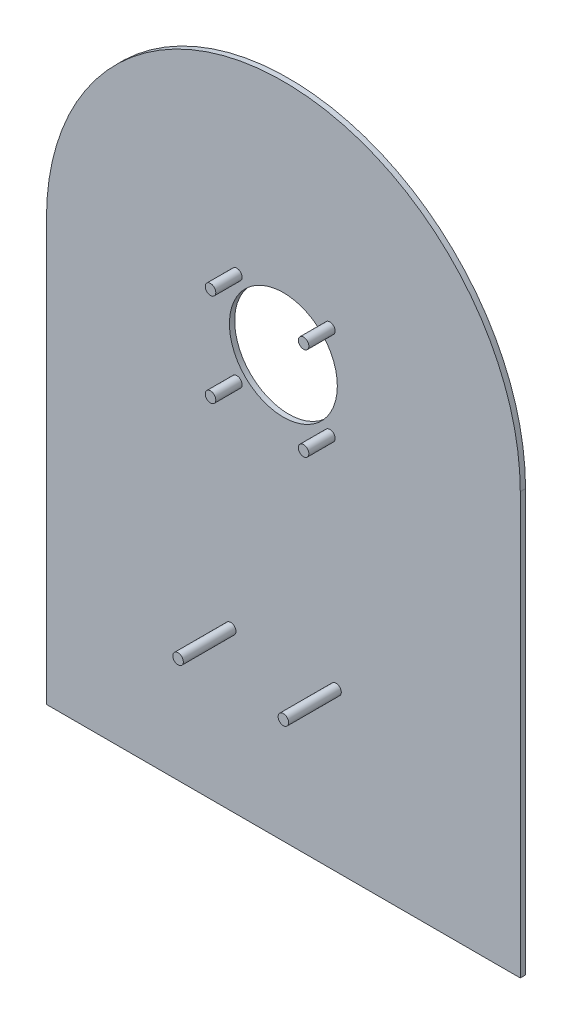
ISO-10303-21;
HEADER;
FILE_DESCRIPTION(('STEP AP214'),'2;1');
FILE_NAME('part.step','',(''),(''),'','','');
FILE_SCHEMA(('AUTOMOTIVE_DESIGN { 1 0 10303 214 1 1 1 1 }'));
ENDSEC;
DATA;
#1=APPLICATION_CONTEXT('core data for automotive mechanical design processes');
#2=APPLICATION_PROTOCOL_DEFINITION('international standard','automotive_design',2000,#1);
#3=PRODUCT_CONTEXT('',#1,'mechanical');
#4=PRODUCT('Part','Part','',(#3));
#5=PRODUCT_RELATED_PRODUCT_CATEGORY('part','',(#4));
#6=PRODUCT_DEFINITION_FORMATION('','',#4);
#7=PRODUCT_DEFINITION_CONTEXT('part definition',#1,'design');
#8=PRODUCT_DEFINITION('design','',#6,#7);
#9=PRODUCT_DEFINITION_SHAPE('','',#8);
#10=(LENGTH_UNIT() NAMED_UNIT(*) SI_UNIT(.MILLI.,.METRE.));
#11=(NAMED_UNIT(*) PLANE_ANGLE_UNIT() SI_UNIT($,.RADIAN.));
#12=(NAMED_UNIT(*) SI_UNIT($,.STERADIAN.) SOLID_ANGLE_UNIT());
#13=UNCERTAINTY_MEASURE_WITH_UNIT(LENGTH_MEASURE(1.E-05),#10,'distance_accuracy_value','');
#14=(GEOMETRIC_REPRESENTATION_CONTEXT(3) GLOBAL_UNCERTAINTY_ASSIGNED_CONTEXT((#13)) GLOBAL_UNIT_ASSIGNED_CONTEXT((#10,
#11,#12)) REPRESENTATION_CONTEXT('',''));
#15=CARTESIAN_POINT('',(0.,0.,0.));
#16=DIRECTION('',(0.,0.,1.));
#17=DIRECTION('',(1.,0.,0.));
#18=AXIS2_PLACEMENT_3D('',#15,#16,#17);
#19=CARTESIAN_POINT('',(0.,0.,2.));
#20=DIRECTION('',(0.,0.,1.));
#21=DIRECTION('',(1.,0.,0.));
#22=AXIS2_PLACEMENT_3D('',#19,#20,#21);
#23=PLANE('',#22);
#24=CARTESIAN_POINT('',(-20.,-100.,2.));
#25=DIRECTION('',(0.,0.,1.));
#26=DIRECTION('',(1.,0.,0.));
#27=AXIS2_PLACEMENT_3D('',#24,#25,#26);
#28=CIRCLE('',#27,2.);
#29=CARTESIAN_POINT('',(-18.,-100.,2.));
#30=VERTEX_POINT('',#29);
#31=EDGE_CURVE('E142',#30,#30,#28,.T.);
#32=ORIENTED_EDGE('',*,*,#31,.F.);
#33=EDGE_LOOP('',(#32));
#34=FACE_BOUND('',#33,.T.);
#35=CARTESIAN_POINT('',(17.6776695296637,-17.6776695296637,2.));
#36=DIRECTION('',(0.,0.,1.));
#37=DIRECTION('',(1.,0.,0.));
#38=AXIS2_PLACEMENT_3D('',#35,#36,#37);
#39=CIRCLE('',#38,2.00000000000004);
#40=CARTESIAN_POINT('',(19.6776695296637,-17.6776695296637,2.));
#41=VERTEX_POINT('',#40);
#42=EDGE_CURVE('E130',#41,#41,#39,.T.);
#43=ORIENTED_EDGE('',*,*,#42,.F.);
#44=EDGE_LOOP('',(#43));
#45=FACE_BOUND('',#44,.T.);
#46=CARTESIAN_POINT('',(-17.6776695296637,17.6776695296637,2.));
#47=DIRECTION('',(0.,0.,1.));
#48=DIRECTION('',(1.,0.,0.));
#49=AXIS2_PLACEMENT_3D('',#46,#47,#48);
#50=CIRCLE('',#49,1.99999999999999);
#51=CARTESIAN_POINT('',(-15.6776695296637,17.6776695296637,2.));
#52=VERTEX_POINT('',#51);
#53=EDGE_CURVE('E118',#52,#52,#50,.T.);
#54=ORIENTED_EDGE('',*,*,#53,.F.);
#55=EDGE_LOOP('',(#54));
#56=FACE_BOUND('',#55,.T.);
#57=DIRECTION('',(0.,1.,0.));
#58=VECTOR('',#57,1.);
#59=CARTESIAN_POINT('',(90.,0.,2.));
#60=LINE('',#59,#58);
#61=CARTESIAN_POINT('',(90.,-160.,2.));
#62=VERTEX_POINT('',#61);
#63=CARTESIAN_POINT('',(90.,0.,2.));
#64=VERTEX_POINT('',#63);
#65=EDGE_CURVE('E85',#62,#64,#60,.T.);
#66=ORIENTED_EDGE('',*,*,#65,.T.);
#67=CARTESIAN_POINT('',(0.,0.,2.));
#68=DIRECTION('',(0.,0.,1.));
#69=DIRECTION('',(1.,0.,0.));
#70=AXIS2_PLACEMENT_3D('',#67,#68,#69);
#71=CIRCLE('',#70,90.);
#72=CARTESIAN_POINT('',(-90.,0.,2.));
#73=VERTEX_POINT('',#72);
#74=EDGE_CURVE('E80',#64,#73,#71,.T.);
#75=ORIENTED_EDGE('',*,*,#74,.T.);
#76=DIRECTION('',(0.,-1.,0.));
#77=VECTOR('',#76,1.);
#78=CARTESIAN_POINT('',(-90.,0.,2.));
#79=LINE('',#78,#77);
#80=CARTESIAN_POINT('',(-90.,-160.,2.));
#81=VERTEX_POINT('',#80);
#82=EDGE_CURVE('E83',#73,#81,#79,.T.);
#83=ORIENTED_EDGE('',*,*,#82,.T.);
#84=DIRECTION('',(1.,0.,0.));
#85=VECTOR('',#84,1.);
#86=CARTESIAN_POINT('',(-90.,-160.,2.));
#87=LINE('',#86,#85);
#88=EDGE_CURVE('E50',#81,#62,#87,.T.);
#89=ORIENTED_EDGE('',*,*,#88,.T.);
#90=EDGE_LOOP('',(#66,#75,#83,#89));
#91=FACE_BOUND('',#90,.T.);
#92=CARTESIAN_POINT('',(0.,0.,2.));
#93=DIRECTION('',(0.,0.,1.));
#94=DIRECTION('',(1.,0.,0.));
#95=AXIS2_PLACEMENT_3D('',#92,#93,#94);
#96=CIRCLE('',#95,20.5);
#97=CARTESIAN_POINT('',(20.5,0.,2.));
#98=VERTEX_POINT('',#97);
#99=EDGE_CURVE('E100',#98,#98,#96,.T.);
#100=ORIENTED_EDGE('',*,*,#99,.F.);
#101=EDGE_LOOP('',(#100));
#102=FACE_BOUND('',#101,.T.);
#103=CARTESIAN_POINT('',(17.6776695296638,17.6776695296636,2.));
#104=DIRECTION('',(0.,0.,1.));
#105=DIRECTION('',(1.,0.,0.));
#106=AXIS2_PLACEMENT_3D('',#103,#104,#105);
#107=CIRCLE('',#106,2.00000000000001);
#108=CARTESIAN_POINT('',(19.6776695296638,17.6776695296636,2.));
#109=VERTEX_POINT('',#108);
#110=EDGE_CURVE('E124',#109,#109,#107,.T.);
#111=ORIENTED_EDGE('',*,*,#110,.F.);
#112=EDGE_LOOP('',(#111));
#113=FACE_BOUND('',#112,.T.);
#114=CARTESIAN_POINT('',(-17.6776695296638,-17.6776695296636,2.));
#115=DIRECTION('',(0.,0.,1.));
#116=DIRECTION('',(1.,0.,0.));
#117=AXIS2_PLACEMENT_3D('',#114,#115,#116);
#118=CIRCLE('',#117,2.);
#119=CARTESIAN_POINT('',(-15.6776695296638,-17.6776695296636,2.));
#120=VERTEX_POINT('',#119);
#121=EDGE_CURVE('E136',#120,#120,#118,.T.);
#122=ORIENTED_EDGE('',*,*,#121,.F.);
#123=EDGE_LOOP('',(#122));
#124=FACE_BOUND('',#123,.T.);
#125=CARTESIAN_POINT('',(20.,-100.,2.));
#126=DIRECTION('',(0.,0.,1.));
#127=DIRECTION('',(1.,0.,0.));
#128=AXIS2_PLACEMENT_3D('',#125,#126,#127);
#129=CIRCLE('',#128,2.);
#130=CARTESIAN_POINT('',(22.,-100.,2.));
#131=VERTEX_POINT('',#130);
#132=EDGE_CURVE('E148',#131,#131,#129,.T.);
#133=ORIENTED_EDGE('',*,*,#132,.F.);
#134=EDGE_LOOP('',(#133));
#135=FACE_BOUND('',#134,.T.);
#136=ADVANCED_FACE('F33',(#34,#45,#56,#91,#102,#113,#124,#135),#23,.T.);
#137=CARTESIAN_POINT('',(0.,0.,0.));
#138=DIRECTION('',(0.,0.,1.));
#139=DIRECTION('',(1.,0.,0.));
#140=AXIS2_PLACEMENT_3D('',#137,#138,#139);
#141=PLANE('',#140);
#142=DIRECTION('',(0.,1.,0.));
#143=VECTOR('',#142,1.);
#144=CARTESIAN_POINT('',(90.,0.,0.));
#145=LINE('',#144,#143);
#146=CARTESIAN_POINT('',(90.,-160.,0.));
#147=VERTEX_POINT('',#146);
#148=CARTESIAN_POINT('',(90.,0.,0.));
#149=VERTEX_POINT('',#148);
#150=EDGE_CURVE('E97',#147,#149,#145,.T.);
#151=ORIENTED_EDGE('',*,*,#150,.F.);
#152=DIRECTION('',(1.,0.,0.));
#153=VECTOR('',#152,1.);
#154=CARTESIAN_POINT('',(-90.,-160.,0.));
#155=LINE('',#154,#153);
#156=CARTESIAN_POINT('',(-90.,-160.,0.));
#157=VERTEX_POINT('',#156);
#158=EDGE_CURVE('E73',#157,#147,#155,.T.);
#159=ORIENTED_EDGE('',*,*,#158,.F.);
#160=DIRECTION('',(0.,-1.,0.));
#161=VECTOR('',#160,1.);
#162=CARTESIAN_POINT('',(-90.,0.,0.));
#163=LINE('',#162,#161);
#164=CARTESIAN_POINT('',(-90.,0.,0.));
#165=VERTEX_POINT('',#164);
#166=EDGE_CURVE('E67',#165,#157,#163,.T.);
#167=ORIENTED_EDGE('',*,*,#166,.F.);
#168=CARTESIAN_POINT('',(0.,0.,0.));
#169=DIRECTION('',(0.,0.,1.));
#170=DIRECTION('',(1.,0.,0.));
#171=AXIS2_PLACEMENT_3D('',#168,#169,#170);
#172=CIRCLE('',#171,90.);
#173=EDGE_CURVE('E89',#149,#165,#172,.T.);
#174=ORIENTED_EDGE('',*,*,#173,.F.);
#175=EDGE_LOOP('',(#151,#159,#167,#174));
#176=FACE_BOUND('',#175,.T.);
#177=CARTESIAN_POINT('',(0.,0.,0.));
#178=DIRECTION('',(0.,0.,1.));
#179=DIRECTION('',(1.,0.,0.));
#180=AXIS2_PLACEMENT_3D('',#177,#178,#179);
#181=CIRCLE('',#180,20.5);
#182=CARTESIAN_POINT('',(20.5,0.,0.));
#183=VERTEX_POINT('',#182);
#184=EDGE_CURVE('E112',#183,#183,#181,.T.);
#185=ORIENTED_EDGE('',*,*,#184,.T.);
#186=EDGE_LOOP('',(#185));
#187=FACE_BOUND('',#186,.T.);
#188=ADVANCED_FACE('F108',(#176,#187),#141,.F.);
#189=CARTESIAN_POINT('',(90.,0.,2.));
#190=DIRECTION('',(-1.,0.,0.));
#191=DIRECTION('',(0.,-1.,0.));
#192=AXIS2_PLACEMENT_3D('',#189,#190,#191);
#193=PLANE('',#192);
#194=ORIENTED_EDGE('',*,*,#150,.T.);
#195=DIRECTION('',(0.,0.,-1.));
#196=VECTOR('',#195,1.);
#197=CARTESIAN_POINT('',(90.,0.,2.));
#198=LINE('',#197,#196);
#199=EDGE_CURVE('E11',#64,#149,#198,.T.);
#200=ORIENTED_EDGE('',*,*,#199,.F.);
#201=ORIENTED_EDGE('',*,*,#65,.F.);
#202=DIRECTION('',(0.,0.,-1.));
#203=VECTOR('',#202,1.);
#204=CARTESIAN_POINT('',(90.,-160.,2.));
#205=LINE('',#204,#203);
#206=EDGE_CURVE('E93',#62,#147,#205,.T.);
#207=ORIENTED_EDGE('',*,*,#206,.T.);
#208=EDGE_LOOP('',(#194,#200,#201,#207));
#209=FACE_BOUND('',#208,.T.);
#210=ADVANCED_FACE('F35',(#209),#193,.F.);
#211=CARTESIAN_POINT('',(0.,0.,2.));
#212=DIRECTION('',(0.,0.,-1.));
#213=DIRECTION('',(-1.,0.,0.));
#214=AXIS2_PLACEMENT_3D('',#211,#212,#213);
#215=CYLINDRICAL_SURFACE('',#214,90.);
#216=ORIENTED_EDGE('',*,*,#173,.T.);
#217=DIRECTION('',(0.,0.,-1.));
#218=VECTOR('',#217,1.);
#219=CARTESIAN_POINT('',(-90.,0.,2.));
#220=LINE('',#219,#218);
#221=EDGE_CURVE('E42',#73,#165,#220,.T.);
#222=ORIENTED_EDGE('',*,*,#221,.F.);
#223=ORIENTED_EDGE('',*,*,#74,.F.);
#224=ORIENTED_EDGE('',*,*,#199,.T.);
#225=EDGE_LOOP('',(#216,#222,#223,#224));
#226=FACE_BOUND('',#225,.T.);
#227=ADVANCED_FACE('F88',(#226),#215,.T.);
#228=CARTESIAN_POINT('',(-90.,0.,2.));
#229=DIRECTION('',(1.,0.,0.));
#230=DIRECTION('',(0.,1.,0.));
#231=AXIS2_PLACEMENT_3D('',#228,#229,#230);
#232=PLANE('',#231);
#233=ORIENTED_EDGE('',*,*,#166,.T.);
#234=DIRECTION('',(0.,0.,-1.));
#235=VECTOR('',#234,1.);
#236=CARTESIAN_POINT('',(-90.,-160.,2.));
#237=LINE('',#236,#235);
#238=EDGE_CURVE('E90',#81,#157,#237,.T.);
#239=ORIENTED_EDGE('',*,*,#238,.F.);
#240=ORIENTED_EDGE('',*,*,#82,.F.);
#241=ORIENTED_EDGE('',*,*,#221,.T.);
#242=EDGE_LOOP('',(#233,#239,#240,#241));
#243=FACE_BOUND('',#242,.T.);
#244=ADVANCED_FACE('F91',(#243),#232,.F.);
#245=CARTESIAN_POINT('',(-90.,-160.,2.));
#246=DIRECTION('',(0.,1.,0.));
#247=DIRECTION('',(0.,0.,1.));
#248=AXIS2_PLACEMENT_3D('',#245,#246,#247);
#249=PLANE('',#248);
#250=ORIENTED_EDGE('',*,*,#158,.T.);
#251=ORIENTED_EDGE('',*,*,#206,.F.);
#252=ORIENTED_EDGE('',*,*,#88,.F.);
#253=ORIENTED_EDGE('',*,*,#238,.T.);
#254=EDGE_LOOP('',(#250,#251,#252,#253));
#255=FACE_BOUND('',#254,.T.);
#256=ADVANCED_FACE('F105',(#255),#249,.F.);
#257=CARTESIAN_POINT('',(0.,0.,2.));
#258=DIRECTION('',(0.,0.,-1.));
#259=DIRECTION('',(-1.,0.,0.));
#260=AXIS2_PLACEMENT_3D('',#257,#258,#259);
#261=CYLINDRICAL_SURFACE('',#260,20.5);
#262=ORIENTED_EDGE('',*,*,#99,.T.);
#263=EDGE_LOOP('',(#262));
#264=FACE_BOUND('',#263,.T.);
#265=ORIENTED_EDGE('',*,*,#184,.F.);
#266=EDGE_LOOP('',(#265));
#267=FACE_BOUND('',#266,.T.);
#268=ADVANCED_FACE('F173',(#264,#267),#261,.F.);
#269=CARTESIAN_POINT('',(-17.6776695296637,17.6776695296637,12.));
#270=DIRECTION('',(0.,0.,-1.));
#271=DIRECTION('',(-1.,0.,0.));
#272=AXIS2_PLACEMENT_3D('',#269,#270,#271);
#273=CYLINDRICAL_SURFACE('',#272,1.99999999999999);
#274=CARTESIAN_POINT('',(-17.6776695296637,17.6776695296637,12.));
#275=DIRECTION('',(0.,0.,1.));
#276=DIRECTION('',(1.,0.,0.));
#277=AXIS2_PLACEMENT_3D('',#274,#275,#276);
#278=CIRCLE('',#277,1.99999999999999);
#279=CARTESIAN_POINT('',(-15.6776695296637,17.6776695296637,12.));
#280=VERTEX_POINT('',#279);
#281=EDGE_CURVE('E115',#280,#280,#278,.T.);
#282=ORIENTED_EDGE('',*,*,#281,.F.);
#283=EDGE_LOOP('',(#282));
#284=FACE_BOUND('',#283,.T.);
#285=ORIENTED_EDGE('',*,*,#53,.T.);
#286=EDGE_LOOP('',(#285));
#287=FACE_BOUND('',#286,.T.);
#288=ADVANCED_FACE('F215',(#284,#287),#273,.T.);
#289=CARTESIAN_POINT('',(-17.6776695296637,17.6776695296637,12.));
#290=DIRECTION('',(0.,0.,1.));
#291=DIRECTION('',(1.,0.,0.));
#292=AXIS2_PLACEMENT_3D('',#289,#290,#291);
#293=PLANE('',#292);
#294=ORIENTED_EDGE('',*,*,#281,.T.);
#295=EDGE_LOOP('',(#294));
#296=FACE_BOUND('',#295,.T.);
#297=ADVANCED_FACE('F223',(#296),#293,.T.);
#298=CARTESIAN_POINT('',(17.6776695296638,17.6776695296636,12.));
#299=DIRECTION('',(0.,0.,-1.));
#300=DIRECTION('',(-1.,0.,0.));
#301=AXIS2_PLACEMENT_3D('',#298,#299,#300);
#302=CYLINDRICAL_SURFACE('',#301,2.00000000000001);
#303=CARTESIAN_POINT('',(17.6776695296638,17.6776695296636,12.));
#304=DIRECTION('',(0.,0.,1.));
#305=DIRECTION('',(1.,0.,0.));
#306=AXIS2_PLACEMENT_3D('',#303,#304,#305);
#307=CIRCLE('',#306,2.00000000000001);
#308=CARTESIAN_POINT('',(19.6776695296638,17.6776695296636,12.));
#309=VERTEX_POINT('',#308);
#310=EDGE_CURVE('E121',#309,#309,#307,.T.);
#311=ORIENTED_EDGE('',*,*,#310,.F.);
#312=EDGE_LOOP('',(#311));
#313=FACE_BOUND('',#312,.T.);
#314=ORIENTED_EDGE('',*,*,#110,.T.);
#315=EDGE_LOOP('',(#314));
#316=FACE_BOUND('',#315,.T.);
#317=ADVANCED_FACE('F231',(#313,#316),#302,.T.);
#318=CARTESIAN_POINT('',(17.6776695296638,17.6776695296636,12.));
#319=DIRECTION('',(0.,0.,1.));
#320=DIRECTION('',(1.,0.,0.));
#321=AXIS2_PLACEMENT_3D('',#318,#319,#320);
#322=PLANE('',#321);
#323=ORIENTED_EDGE('',*,*,#310,.T.);
#324=EDGE_LOOP('',(#323));
#325=FACE_BOUND('',#324,.T.);
#326=ADVANCED_FACE('F240',(#325),#322,.T.);
#327=CARTESIAN_POINT('',(17.6776695296637,-17.6776695296637,12.));
#328=DIRECTION('',(0.,0.,-1.));
#329=DIRECTION('',(-1.,0.,0.));
#330=AXIS2_PLACEMENT_3D('',#327,#328,#329);
#331=CYLINDRICAL_SURFACE('',#330,2.00000000000004);
#332=CARTESIAN_POINT('',(17.6776695296637,-17.6776695296637,12.));
#333=DIRECTION('',(0.,0.,1.));
#334=DIRECTION('',(1.,0.,0.));
#335=AXIS2_PLACEMENT_3D('',#332,#333,#334);
#336=CIRCLE('',#335,2.00000000000004);
#337=CARTESIAN_POINT('',(19.6776695296637,-17.6776695296637,12.));
#338=VERTEX_POINT('',#337);
#339=EDGE_CURVE('E127',#338,#338,#336,.T.);
#340=ORIENTED_EDGE('',*,*,#339,.F.);
#341=EDGE_LOOP('',(#340));
#342=FACE_BOUND('',#341,.T.);
#343=ORIENTED_EDGE('',*,*,#42,.T.);
#344=EDGE_LOOP('',(#343));
#345=FACE_BOUND('',#344,.T.);
#346=ADVANCED_FACE('F249',(#342,#345),#331,.T.);
#347=CARTESIAN_POINT('',(17.6776695296637,-17.6776695296637,12.));
#348=DIRECTION('',(0.,0.,1.));
#349=DIRECTION('',(1.,0.,0.));
#350=AXIS2_PLACEMENT_3D('',#347,#348,#349);
#351=PLANE('',#350);
#352=ORIENTED_EDGE('',*,*,#339,.T.);
#353=EDGE_LOOP('',(#352));
#354=FACE_BOUND('',#353,.T.);
#355=ADVANCED_FACE('F258',(#354),#351,.T.);
#356=CARTESIAN_POINT('',(-17.6776695296638,-17.6776695296636,12.));
#357=DIRECTION('',(0.,0.,-1.));
#358=DIRECTION('',(-1.,0.,0.));
#359=AXIS2_PLACEMENT_3D('',#356,#357,#358);
#360=CYLINDRICAL_SURFACE('',#359,2.);
#361=CARTESIAN_POINT('',(-17.6776695296638,-17.6776695296636,12.));
#362=DIRECTION('',(0.,0.,1.));
#363=DIRECTION('',(1.,0.,0.));
#364=AXIS2_PLACEMENT_3D('',#361,#362,#363);
#365=CIRCLE('',#364,2.);
#366=CARTESIAN_POINT('',(-15.6776695296638,-17.6776695296636,12.));
#367=VERTEX_POINT('',#366);
#368=EDGE_CURVE('E133',#367,#367,#365,.T.);
#369=ORIENTED_EDGE('',*,*,#368,.F.);
#370=EDGE_LOOP('',(#369));
#371=FACE_BOUND('',#370,.T.);
#372=ORIENTED_EDGE('',*,*,#121,.T.);
#373=EDGE_LOOP('',(#372));
#374=FACE_BOUND('',#373,.T.);
#375=ADVANCED_FACE('F267',(#371,#374),#360,.T.);
#376=CARTESIAN_POINT('',(-17.6776695296638,-17.6776695296636,12.));
#377=DIRECTION('',(0.,0.,1.));
#378=DIRECTION('',(1.,0.,0.));
#379=AXIS2_PLACEMENT_3D('',#376,#377,#378);
#380=PLANE('',#379);
#381=ORIENTED_EDGE('',*,*,#368,.T.);
#382=EDGE_LOOP('',(#381));
#383=FACE_BOUND('',#382,.T.);
#384=ADVANCED_FACE('F276',(#383),#380,.T.);
#385=CARTESIAN_POINT('',(-20.,-100.,22.));
#386=DIRECTION('',(0.,0.,-1.));
#387=DIRECTION('',(-1.,0.,0.));
#388=AXIS2_PLACEMENT_3D('',#385,#386,#387);
#389=CYLINDRICAL_SURFACE('',#388,2.);
#390=CARTESIAN_POINT('',(-20.,-100.,22.));
#391=DIRECTION('',(0.,0.,1.));
#392=DIRECTION('',(1.,0.,0.));
#393=AXIS2_PLACEMENT_3D('',#390,#391,#392);
#394=CIRCLE('',#393,2.);
#395=CARTESIAN_POINT('',(-18.,-100.,22.));
#396=VERTEX_POINT('',#395);
#397=EDGE_CURVE('E139',#396,#396,#394,.T.);
#398=ORIENTED_EDGE('',*,*,#397,.F.);
#399=EDGE_LOOP('',(#398));
#400=FACE_BOUND('',#399,.T.);
#401=ORIENTED_EDGE('',*,*,#31,.T.);
#402=EDGE_LOOP('',(#401));
#403=FACE_BOUND('',#402,.T.);
#404=ADVANCED_FACE('F285',(#400,#403),#389,.T.);
#405=CARTESIAN_POINT('',(-20.,-100.,22.));
#406=DIRECTION('',(0.,0.,1.));
#407=DIRECTION('',(1.,0.,0.));
#408=AXIS2_PLACEMENT_3D('',#405,#406,#407);
#409=PLANE('',#408);
#410=ORIENTED_EDGE('',*,*,#397,.T.);
#411=EDGE_LOOP('',(#410));
#412=FACE_BOUND('',#411,.T.);
#413=ADVANCED_FACE('F159',(#412),#409,.T.);
#414=CARTESIAN_POINT('',(20.,-100.,22.));
#415=DIRECTION('',(0.,0.,-1.));
#416=DIRECTION('',(-1.,0.,0.));
#417=AXIS2_PLACEMENT_3D('',#414,#415,#416);
#418=CYLINDRICAL_SURFACE('',#417,2.);
#419=CARTESIAN_POINT('',(20.,-100.,22.));
#420=DIRECTION('',(0.,0.,1.));
#421=DIRECTION('',(1.,0.,0.));
#422=AXIS2_PLACEMENT_3D('',#419,#420,#421);
#423=CIRCLE('',#422,2.);
#424=CARTESIAN_POINT('',(22.,-100.,22.));
#425=VERTEX_POINT('',#424);
#426=EDGE_CURVE('E145',#425,#425,#423,.T.);
#427=ORIENTED_EDGE('',*,*,#426,.F.);
#428=EDGE_LOOP('',(#427));
#429=FACE_BOUND('',#428,.T.);
#430=ORIENTED_EDGE('',*,*,#132,.T.);
#431=EDGE_LOOP('',(#430));
#432=FACE_BOUND('',#431,.T.);
#433=ADVANCED_FACE('F156',(#429,#432),#418,.T.);
#434=CARTESIAN_POINT('',(20.,-100.,22.));
#435=DIRECTION('',(0.,0.,1.));
#436=DIRECTION('',(1.,0.,0.));
#437=AXIS2_PLACEMENT_3D('',#434,#435,#436);
#438=PLANE('',#437);
#439=ORIENTED_EDGE('',*,*,#426,.T.);
#440=EDGE_LOOP('',(#439));
#441=FACE_BOUND('',#440,.T.);
#442=ADVANCED_FACE('F154',(#441),#438,.T.);
#443=CLOSED_SHELL('',(#136,#188,#210,#227,#244,#256,#268,#288,#297,#317,#326,#346,#355,#375,
#384,#404,#413,#433,#442));
#444=MANIFOLD_SOLID_BREP('B2',#443);
#445=ADVANCED_BREP_SHAPE_REPRESENTATION('',(#18,#444),#14);
#446=SHAPE_DEFINITION_REPRESENTATION(#9,#445);
ENDSEC;
END-ISO-10303-21;
